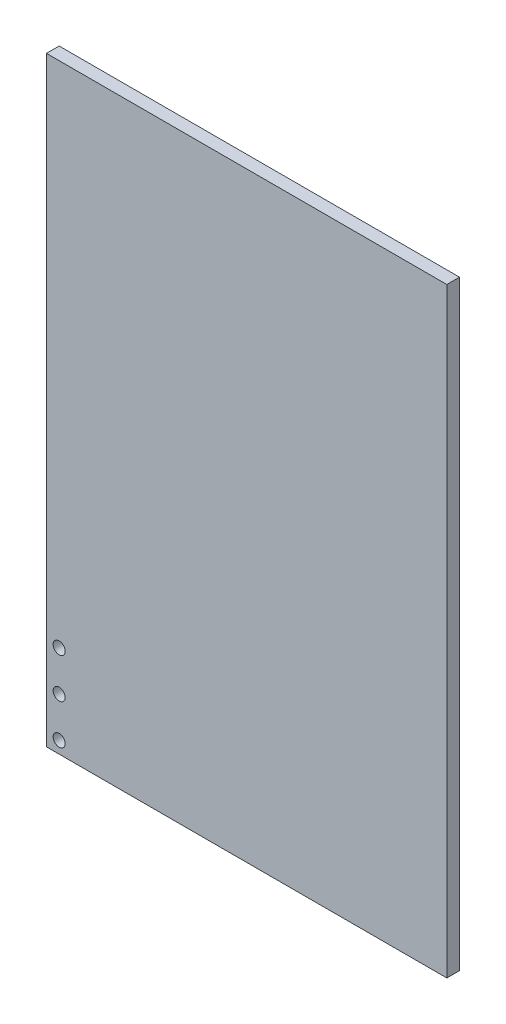
ISO-10303-21;
HEADER;
FILE_DESCRIPTION(('STEP AP214'),'2;1');
FILE_NAME('part.step','',(''),(''),'','','');
FILE_SCHEMA(('AUTOMOTIVE_DESIGN { 1 0 10303 214 1 1 1 1 }'));
ENDSEC;
DATA;
#1=APPLICATION_CONTEXT('core data for automotive mechanical design processes');
#2=APPLICATION_PROTOCOL_DEFINITION('international standard','automotive_design',2000,#1);
#3=PRODUCT_CONTEXT('',#1,'mechanical');
#4=PRODUCT('Part','Part','',(#3));
#5=PRODUCT_RELATED_PRODUCT_CATEGORY('part','',(#4));
#6=PRODUCT_DEFINITION_FORMATION('','',#4);
#7=PRODUCT_DEFINITION_CONTEXT('part definition',#1,'design');
#8=PRODUCT_DEFINITION('design','',#6,#7);
#9=PRODUCT_DEFINITION_SHAPE('','',#8);
#10=(LENGTH_UNIT() NAMED_UNIT(*) SI_UNIT(.MILLI.,.METRE.));
#11=(NAMED_UNIT(*) PLANE_ANGLE_UNIT() SI_UNIT($,.RADIAN.));
#12=(NAMED_UNIT(*) SI_UNIT($,.STERADIAN.) SOLID_ANGLE_UNIT());
#13=UNCERTAINTY_MEASURE_WITH_UNIT(LENGTH_MEASURE(1.E-05),#10,'distance_accuracy_value','');
#14=(GEOMETRIC_REPRESENTATION_CONTEXT(3) GLOBAL_UNCERTAINTY_ASSIGNED_CONTEXT((#13)) GLOBAL_UNIT_ASSIGNED_CONTEXT((#10,
#11,#12)) REPRESENTATION_CONTEXT('',''));
#15=CARTESIAN_POINT('',(0.,0.,0.));
#16=DIRECTION('',(0.,0.,1.));
#17=DIRECTION('',(1.,0.,0.));
#18=AXIS2_PLACEMENT_3D('',#15,#16,#17);
#19=CARTESIAN_POINT('',(0.,150.,0.));
#20=DIRECTION('',(1.,0.,0.));
#21=DIRECTION('',(0.,0.,-1.));
#22=AXIS2_PLACEMENT_3D('',#19,#20,#21);
#23=PLANE('',#22);
#24=DIRECTION('',(0.,0.,1.));
#25=VECTOR('',#24,1.);
#26=CARTESIAN_POINT('',(0.,0.,0.));
#27=LINE('',#26,#25);
#28=CARTESIAN_POINT('',(0.,0.,-3.175));
#29=VERTEX_POINT('',#28);
#30=CARTESIAN_POINT('',(0.,0.,0.));
#31=VERTEX_POINT('',#30);
#32=EDGE_CURVE('E106',#29,#31,#27,.T.);
#33=ORIENTED_EDGE('',*,*,#32,.T.);
#34=DIRECTION('',(0.,-1.,0.));
#35=VECTOR('',#34,1.);
#36=CARTESIAN_POINT('',(0.,150.,0.));
#37=LINE('',#36,#35);
#38=CARTESIAN_POINT('',(0.,150.,0.));
#39=VERTEX_POINT('',#38);
#40=EDGE_CURVE('E11',#39,#31,#37,.T.);
#41=ORIENTED_EDGE('',*,*,#40,.F.);
#42=DIRECTION('',(0.,0.,1.));
#43=VECTOR('',#42,1.);
#44=CARTESIAN_POINT('',(0.,150.,0.));
#45=LINE('',#44,#43);
#46=CARTESIAN_POINT('',(0.,150.,-3.175));
#47=VERTEX_POINT('',#46);
#48=EDGE_CURVE('E90',#47,#39,#45,.T.);
#49=ORIENTED_EDGE('',*,*,#48,.F.);
#50=DIRECTION('',(0.,-1.,0.));
#51=VECTOR('',#50,1.);
#52=CARTESIAN_POINT('',(0.,150.,-3.175));
#53=LINE('',#52,#51);
#54=EDGE_CURVE('E102',#47,#29,#53,.T.);
#55=ORIENTED_EDGE('',*,*,#54,.T.);
#56=EDGE_LOOP('',(#33,#41,#49,#55));
#57=FACE_BOUND('',#56,.T.);
#58=ADVANCED_FACE('F38',(#57),#23,.F.);
#59=CARTESIAN_POINT('',(0.,150.,0.));
#60=DIRECTION('',(0.,0.,-1.));
#61=DIRECTION('',(-1.,0.,0.));
#62=AXIS2_PLACEMENT_3D('',#59,#60,#61);
#63=PLANE('',#62);
#64=CARTESIAN_POINT('',(3.175,23.,0.));
#65=DIRECTION('',(0.,0.,1.));
#66=DIRECTION('',(1.,0.,0.));
#67=AXIS2_PLACEMENT_3D('',#64,#65,#66);
#68=CIRCLE('',#67,1.5);
#69=CARTESIAN_POINT('',(4.675,23.,0.));
#70=VERTEX_POINT('',#69);
#71=EDGE_CURVE('E143',#70,#70,#68,.T.);
#72=ORIENTED_EDGE('',*,*,#71,.F.);
#73=EDGE_LOOP('',(#72));
#74=FACE_BOUND('',#73,.T.);
#75=CARTESIAN_POINT('',(3.175,3.,0.));
#76=DIRECTION('',(0.,0.,1.));
#77=DIRECTION('',(1.,0.,0.));
#78=AXIS2_PLACEMENT_3D('',#75,#76,#77);
#79=CIRCLE('',#78,1.5);
#80=CARTESIAN_POINT('',(4.675,3.,0.));
#81=VERTEX_POINT('',#80);
#82=EDGE_CURVE('E136',#81,#81,#79,.T.);
#83=ORIENTED_EDGE('',*,*,#82,.F.);
#84=EDGE_LOOP('',(#83));
#85=FACE_BOUND('',#84,.T.);
#86=CARTESIAN_POINT('',(3.175,13.,0.));
#87=DIRECTION('',(0.,0.,1.));
#88=DIRECTION('',(1.,0.,0.));
#89=AXIS2_PLACEMENT_3D('',#86,#87,#88);
#90=CIRCLE('',#89,1.5);
#91=CARTESIAN_POINT('',(4.675,13.,0.));
#92=VERTEX_POINT('',#91);
#93=EDGE_CURVE('E131',#92,#92,#90,.T.);
#94=ORIENTED_EDGE('',*,*,#93,.F.);
#95=EDGE_LOOP('',(#94));
#96=FACE_BOUND('',#95,.T.);
#97=DIRECTION('',(1.,0.,0.));
#98=VECTOR('',#97,1.);
#99=CARTESIAN_POINT('',(0.,0.,0.));
#100=LINE('',#99,#98);
#101=CARTESIAN_POINT('',(100.,0.,0.));
#102=VERTEX_POINT('',#101);
#103=EDGE_CURVE('E95',#31,#102,#100,.T.);
#104=ORIENTED_EDGE('',*,*,#103,.T.);
#105=DIRECTION('',(0.,-1.,0.));
#106=VECTOR('',#105,1.);
#107=CARTESIAN_POINT('',(100.,150.,0.));
#108=LINE('',#107,#106);
#109=CARTESIAN_POINT('',(100.,150.,0.));
#110=VERTEX_POINT('',#109);
#111=EDGE_CURVE('E47',#110,#102,#108,.T.);
#112=ORIENTED_EDGE('',*,*,#111,.F.);
#113=DIRECTION('',(1.,0.,0.));
#114=VECTOR('',#113,1.);
#115=CARTESIAN_POINT('',(0.,150.,0.));
#116=LINE('',#115,#114);
#117=EDGE_CURVE('E85',#39,#110,#116,.T.);
#118=ORIENTED_EDGE('',*,*,#117,.F.);
#119=ORIENTED_EDGE('',*,*,#40,.T.);
#120=EDGE_LOOP('',(#104,#112,#118,#119));
#121=FACE_BOUND('',#120,.T.);
#122=ADVANCED_FACE('F94',(#74,#85,#96,#121),#63,.F.);
#123=CARTESIAN_POINT('',(100.,150.,0.));
#124=DIRECTION('',(-1.,0.,0.));
#125=DIRECTION('',(0.,0.,1.));
#126=AXIS2_PLACEMENT_3D('',#123,#124,#125);
#127=PLANE('',#126);
#128=DIRECTION('',(0.,0.,-1.));
#129=VECTOR('',#128,1.);
#130=CARTESIAN_POINT('',(100.,0.,0.));
#131=LINE('',#130,#129);
#132=CARTESIAN_POINT('',(100.,0.,-3.175));
#133=VERTEX_POINT('',#132);
#134=EDGE_CURVE('E72',#102,#133,#131,.T.);
#135=ORIENTED_EDGE('',*,*,#134,.T.);
#136=DIRECTION('',(0.,-1.,0.));
#137=VECTOR('',#136,1.);
#138=CARTESIAN_POINT('',(100.,150.,-3.175));
#139=LINE('',#138,#137);
#140=CARTESIAN_POINT('',(100.,150.,-3.175));
#141=VERTEX_POINT('',#140);
#142=EDGE_CURVE('E97',#141,#133,#139,.T.);
#143=ORIENTED_EDGE('',*,*,#142,.F.);
#144=DIRECTION('',(0.,0.,-1.));
#145=VECTOR('',#144,1.);
#146=CARTESIAN_POINT('',(100.,150.,0.));
#147=LINE('',#146,#145);
#148=EDGE_CURVE('E88',#110,#141,#147,.T.);
#149=ORIENTED_EDGE('',*,*,#148,.F.);
#150=ORIENTED_EDGE('',*,*,#111,.T.);
#151=EDGE_LOOP('',(#135,#143,#149,#150));
#152=FACE_BOUND('',#151,.T.);
#153=ADVANCED_FACE('F98',(#152),#127,.F.);
#154=CARTESIAN_POINT('',(0.,150.,-3.175));
#155=DIRECTION('',(0.,0.,1.));
#156=DIRECTION('',(1.,0.,0.));
#157=AXIS2_PLACEMENT_3D('',#154,#155,#156);
#158=PLANE('',#157);
#159=CARTESIAN_POINT('',(3.175,23.,-3.175));
#160=DIRECTION('',(0.,0.,1.));
#161=DIRECTION('',(1.,0.,0.));
#162=AXIS2_PLACEMENT_3D('',#159,#160,#161);
#163=CIRCLE('',#162,1.5);
#164=CARTESIAN_POINT('',(4.675,23.,-3.175));
#165=VERTEX_POINT('',#164);
#166=EDGE_CURVE('E132',#165,#165,#163,.T.);
#167=ORIENTED_EDGE('',*,*,#166,.T.);
#168=EDGE_LOOP('',(#167));
#169=FACE_BOUND('',#168,.T.);
#170=CARTESIAN_POINT('',(3.175,3.,-3.175));
#171=DIRECTION('',(0.,0.,1.));
#172=DIRECTION('',(1.,0.,0.));
#173=AXIS2_PLACEMENT_3D('',#170,#171,#172);
#174=CIRCLE('',#173,1.5);
#175=CARTESIAN_POINT('',(4.675,3.,-3.175));
#176=VERTEX_POINT('',#175);
#177=EDGE_CURVE('E110',#176,#176,#174,.T.);
#178=ORIENTED_EDGE('',*,*,#177,.T.);
#179=EDGE_LOOP('',(#178));
#180=FACE_BOUND('',#179,.T.);
#181=CARTESIAN_POINT('',(3.175,13.,-3.175));
#182=DIRECTION('',(0.,0.,1.));
#183=DIRECTION('',(1.,0.,0.));
#184=AXIS2_PLACEMENT_3D('',#181,#182,#183);
#185=CIRCLE('',#184,1.5);
#186=CARTESIAN_POINT('',(4.675,13.,-3.175));
#187=VERTEX_POINT('',#186);
#188=EDGE_CURVE('E127',#187,#187,#185,.T.);
#189=ORIENTED_EDGE('',*,*,#188,.T.);
#190=EDGE_LOOP('',(#189));
#191=FACE_BOUND('',#190,.T.);
#192=DIRECTION('',(-1.,0.,0.));
#193=VECTOR('',#192,1.);
#194=CARTESIAN_POINT('',(0.,0.,-3.175));
#195=LINE('',#194,#193);
#196=EDGE_CURVE('E78',#133,#29,#195,.T.);
#197=ORIENTED_EDGE('',*,*,#196,.T.);
#198=ORIENTED_EDGE('',*,*,#54,.F.);
#199=DIRECTION('',(-1.,0.,0.));
#200=VECTOR('',#199,1.);
#201=CARTESIAN_POINT('',(0.,150.,-3.175));
#202=LINE('',#201,#200);
#203=EDGE_CURVE('E55',#141,#47,#202,.T.);
#204=ORIENTED_EDGE('',*,*,#203,.F.);
#205=ORIENTED_EDGE('',*,*,#142,.T.);
#206=EDGE_LOOP('',(#197,#198,#204,#205));
#207=FACE_BOUND('',#206,.T.);
#208=ADVANCED_FACE('F120',(#169,#180,#191,#207),#158,.F.);
#209=CARTESIAN_POINT('',(0.,150.,0.));
#210=DIRECTION('',(0.,-1.,0.));
#211=DIRECTION('',(0.,0.,-1.));
#212=AXIS2_PLACEMENT_3D('',#209,#210,#211);
#213=PLANE('',#212);
#214=ORIENTED_EDGE('',*,*,#48,.T.);
#215=ORIENTED_EDGE('',*,*,#117,.T.);
#216=ORIENTED_EDGE('',*,*,#148,.T.);
#217=ORIENTED_EDGE('',*,*,#203,.T.);
#218=EDGE_LOOP('',(#214,#215,#216,#217));
#219=FACE_BOUND('',#218,.T.);
#220=ADVANCED_FACE('F86',(#219),#213,.F.);
#221=CARTESIAN_POINT('',(0.,0.,0.));
#222=DIRECTION('',(0.,-1.,0.));
#223=DIRECTION('',(0.,0.,-1.));
#224=AXIS2_PLACEMENT_3D('',#221,#222,#223);
#225=PLANE('',#224);
#226=ORIENTED_EDGE('',*,*,#32,.F.);
#227=ORIENTED_EDGE('',*,*,#196,.F.);
#228=ORIENTED_EDGE('',*,*,#134,.F.);
#229=ORIENTED_EDGE('',*,*,#103,.F.);
#230=EDGE_LOOP('',(#226,#227,#228,#229));
#231=FACE_BOUND('',#230,.T.);
#232=ADVANCED_FACE('F123',(#231),#225,.T.);
#233=CARTESIAN_POINT('',(3.175,13.,-3.175));
#234=DIRECTION('',(0.,0.,1.));
#235=DIRECTION('',(1.,0.,0.));
#236=AXIS2_PLACEMENT_3D('',#233,#234,#235);
#237=CYLINDRICAL_SURFACE('',#236,1.5);
#238=ORIENTED_EDGE('',*,*,#188,.F.);
#239=EDGE_LOOP('',(#238));
#240=FACE_BOUND('',#239,.T.);
#241=ORIENTED_EDGE('',*,*,#93,.T.);
#242=EDGE_LOOP('',(#241));
#243=FACE_BOUND('',#242,.T.);
#244=ADVANCED_FACE('F166',(#240,#243),#237,.F.);
#245=CARTESIAN_POINT('',(3.175,3.,-3.175));
#246=DIRECTION('',(0.,0.,1.));
#247=DIRECTION('',(1.,0.,0.));
#248=AXIS2_PLACEMENT_3D('',#245,#246,#247);
#249=CYLINDRICAL_SURFACE('',#248,1.5);
#250=ORIENTED_EDGE('',*,*,#177,.F.);
#251=EDGE_LOOP('',(#250));
#252=FACE_BOUND('',#251,.T.);
#253=ORIENTED_EDGE('',*,*,#82,.T.);
#254=EDGE_LOOP('',(#253));
#255=FACE_BOUND('',#254,.T.);
#256=ADVANCED_FACE('F156',(#252,#255),#249,.F.);
#257=CARTESIAN_POINT('',(3.175,23.,-3.175));
#258=DIRECTION('',(0.,0.,1.));
#259=DIRECTION('',(1.,0.,0.));
#260=AXIS2_PLACEMENT_3D('',#257,#258,#259);
#261=CYLINDRICAL_SURFACE('',#260,1.5);
#262=ORIENTED_EDGE('',*,*,#166,.F.);
#263=EDGE_LOOP('',(#262));
#264=FACE_BOUND('',#263,.T.);
#265=ORIENTED_EDGE('',*,*,#71,.T.);
#266=EDGE_LOOP('',(#265));
#267=FACE_BOUND('',#266,.T.);
#268=ADVANCED_FACE('F153',(#264,#267),#261,.F.);
#269=CLOSED_SHELL('',(#58,#122,#153,#208,#220,#232,#244,#256,#268));
#270=MANIFOLD_SOLID_BREP('B2',#269);
#271=ADVANCED_BREP_SHAPE_REPRESENTATION('',(#18,#270),#14);
#272=SHAPE_DEFINITION_REPRESENTATION(#9,#271);
ENDSEC;
END-ISO-10303-21;
